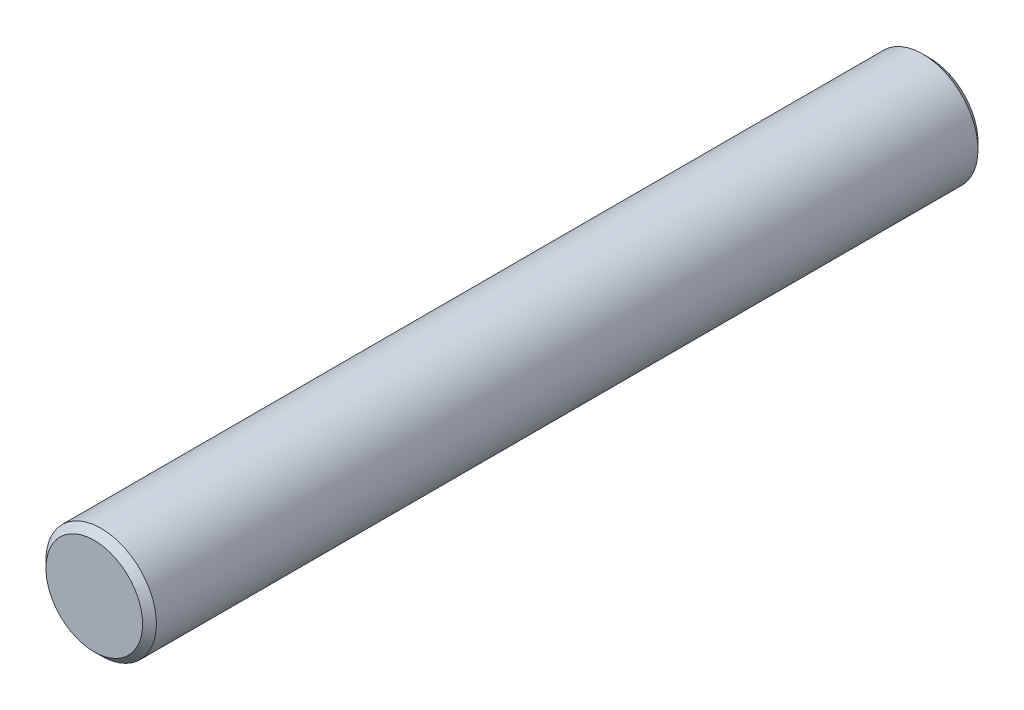
ISO-10303-21;
HEADER;
FILE_DESCRIPTION(('STEP AP214'),'2;1');
FILE_NAME('part.step','',(''),(''),'','','');
FILE_SCHEMA(('AUTOMOTIVE_DESIGN { 1 0 10303 214 1 1 1 1 }'));
ENDSEC;
DATA;
#1=APPLICATION_CONTEXT('core data for automotive mechanical design processes');
#2=APPLICATION_PROTOCOL_DEFINITION('international standard','automotive_design',2000,#1);
#3=PRODUCT_CONTEXT('',#1,'mechanical');
#4=PRODUCT('Part','Part','',(#3));
#5=PRODUCT_RELATED_PRODUCT_CATEGORY('part','',(#4));
#6=PRODUCT_DEFINITION_FORMATION('','',#4);
#7=PRODUCT_DEFINITION_CONTEXT('part definition',#1,'design');
#8=PRODUCT_DEFINITION('design','',#6,#7);
#9=PRODUCT_DEFINITION_SHAPE('','',#8);
#10=(LENGTH_UNIT() NAMED_UNIT(*) SI_UNIT(.MILLI.,.METRE.));
#11=(NAMED_UNIT(*) PLANE_ANGLE_UNIT() SI_UNIT($,.RADIAN.));
#12=(NAMED_UNIT(*) SI_UNIT($,.STERADIAN.) SOLID_ANGLE_UNIT());
#13=UNCERTAINTY_MEASURE_WITH_UNIT(LENGTH_MEASURE(1.E-05),#10,'distance_accuracy_value','');
#14=(GEOMETRIC_REPRESENTATION_CONTEXT(3) GLOBAL_UNCERTAINTY_ASSIGNED_CONTEXT((#13)) GLOBAL_UNIT_ASSIGNED_CONTEXT((#10,
#11,#12)) REPRESENTATION_CONTEXT('',''));
#15=CARTESIAN_POINT('',(0.,0.,0.));
#16=DIRECTION('',(0.,0.,1.));
#17=DIRECTION('',(1.,0.,0.));
#18=AXIS2_PLACEMENT_3D('',#15,#16,#17);
#19=CARTESIAN_POINT('',(0.,0.,121.));
#20=DIRECTION('',(0.,0.,-1.));
#21=DIRECTION('',(-1.,0.,0.));
#22=AXIS2_PLACEMENT_3D('',#19,#20,#21);
#23=CYLINDRICAL_SURFACE('',#22,8.);
#24=CARTESIAN_POINT('',(0.,0.,1.));
#25=DIRECTION('',(0.,0.,1.));
#26=DIRECTION('',(1.,0.,0.));
#27=AXIS2_PLACEMENT_3D('',#24,#25,#26);
#28=CIRCLE('',#27,8.);
#29=CARTESIAN_POINT('',(8.,0.,1.));
#30=VERTEX_POINT('',#29);
#31=EDGE_CURVE('E51',#30,#30,#28,.T.);
#32=ORIENTED_EDGE('',*,*,#31,.T.);
#33=EDGE_LOOP('',(#32));
#34=FACE_BOUND('',#33,.T.);
#35=CARTESIAN_POINT('',(0.,0.,120.));
#36=DIRECTION('',(0.,0.,1.));
#37=DIRECTION('',(1.,0.,0.));
#38=AXIS2_PLACEMENT_3D('',#35,#36,#37);
#39=CIRCLE('',#38,8.);
#40=CARTESIAN_POINT('',(8.,0.,120.));
#41=VERTEX_POINT('',#40);
#42=EDGE_CURVE('E55',#41,#41,#39,.F.);
#43=ORIENTED_EDGE('',*,*,#42,.T.);
#44=EDGE_LOOP('',(#43));
#45=FACE_BOUND('',#44,.T.);
#46=ADVANCED_FACE('F39',(#34,#45),#23,.T.);
#47=CARTESIAN_POINT('',(0.,0.,121.));
#48=DIRECTION('',(0.,0.,1.));
#49=DIRECTION('',(1.,0.,0.));
#50=AXIS2_PLACEMENT_3D('',#47,#48,#49);
#51=PLANE('',#50);
#52=CARTESIAN_POINT('',(0.,0.,121.));
#53=DIRECTION('',(0.,0.,1.));
#54=DIRECTION('',(1.,0.,0.));
#55=AXIS2_PLACEMENT_3D('',#52,#53,#54);
#56=CIRCLE('',#55,6.99999999999999);
#57=CARTESIAN_POINT('',(6.99999999999999,0.,121.));
#58=VERTEX_POINT('',#57);
#59=EDGE_CURVE('E10',#58,#58,#56,.T.);
#60=ORIENTED_EDGE('',*,*,#59,.T.);
#61=EDGE_LOOP('',(#60));
#62=FACE_BOUND('',#61,.T.);
#63=ADVANCED_FACE('F71',(#62),#51,.T.);
#64=CARTESIAN_POINT('',(0.,0.,0.));
#65=DIRECTION('',(0.,0.,1.));
#66=DIRECTION('',(1.,0.,0.));
#67=AXIS2_PLACEMENT_3D('',#64,#65,#66);
#68=PLANE('',#67);
#69=CARTESIAN_POINT('',(0.,0.,0.));
#70=DIRECTION('',(0.,0.,1.));
#71=DIRECTION('',(1.,0.,0.));
#72=AXIS2_PLACEMENT_3D('',#69,#70,#71);
#73=CIRCLE('',#72,6.99999999999999);
#74=CARTESIAN_POINT('',(6.99999999999999,0.,0.));
#75=VERTEX_POINT('',#74);
#76=EDGE_CURVE('E47',#75,#75,#73,.F.);
#77=ORIENTED_EDGE('',*,*,#76,.T.);
#78=EDGE_LOOP('',(#77));
#79=FACE_BOUND('',#78,.T.);
#80=ADVANCED_FACE('F68',(#79),#68,.F.);
#81=CARTESIAN_POINT('',(0.,0.,1.));
#82=DIRECTION('',(0.,0.,1.));
#83=DIRECTION('',(1.,0.,0.));
#84=AXIS2_PLACEMENT_3D('',#81,#82,#83);
#85=CONICAL_SURFACE('',#84,8.,0.785398163397452);
#86=ORIENTED_EDGE('',*,*,#76,.F.);
#87=EDGE_LOOP('',(#86));
#88=FACE_BOUND('',#87,.T.);
#89=ORIENTED_EDGE('',*,*,#31,.F.);
#90=EDGE_LOOP('',(#89));
#91=FACE_BOUND('',#90,.T.);
#92=ADVANCED_FACE('F64',(#88,#91),#85,.T.);
#93=CARTESIAN_POINT('',(0.,0.,121.));
#94=DIRECTION('',(0.,0.,-1.));
#95=DIRECTION('',(-1.,0.,0.));
#96=AXIS2_PLACEMENT_3D('',#93,#94,#95);
#97=CONICAL_SURFACE('',#96,6.99999999999999,0.785398163397438);
#98=ORIENTED_EDGE('',*,*,#42,.F.);
#99=EDGE_LOOP('',(#98));
#100=FACE_BOUND('',#99,.T.);
#101=ORIENTED_EDGE('',*,*,#59,.F.);
#102=EDGE_LOOP('',(#101));
#103=FACE_BOUND('',#102,.T.);
#104=ADVANCED_FACE('F42',(#100,#103),#97,.T.);
#105=CLOSED_SHELL('',(#46,#63,#80,#92,#104));
#106=MANIFOLD_SOLID_BREP('B2',#105);
#107=ADVANCED_BREP_SHAPE_REPRESENTATION('',(#18,#106),#14);
#108=SHAPE_DEFINITION_REPRESENTATION(#9,#107);
ENDSEC;
END-ISO-10303-21;
